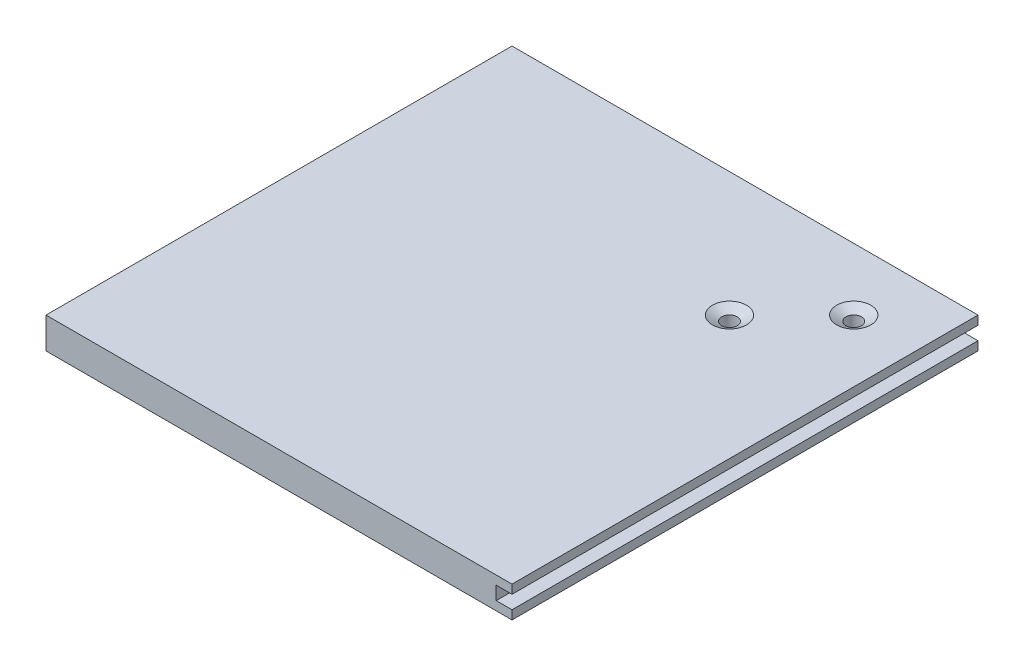
ISO-10303-21;
HEADER;
FILE_DESCRIPTION(('STEP AP214'),'2;1');
FILE_NAME('part.step','',(''),(''),'','','');
FILE_SCHEMA(('AUTOMOTIVE_DESIGN { 1 0 10303 214 1 1 1 1 }'));
ENDSEC;
DATA;
#1=APPLICATION_CONTEXT('core data for automotive mechanical design processes');
#2=APPLICATION_PROTOCOL_DEFINITION('international standard','automotive_design',2000,#1);
#3=PRODUCT_CONTEXT('',#1,'mechanical');
#4=PRODUCT('Part','Part','',(#3));
#5=PRODUCT_RELATED_PRODUCT_CATEGORY('part','',(#4));
#6=PRODUCT_DEFINITION_FORMATION('','',#4);
#7=PRODUCT_DEFINITION_CONTEXT('part definition',#1,'design');
#8=PRODUCT_DEFINITION('design','',#6,#7);
#9=PRODUCT_DEFINITION_SHAPE('','',#8);
#10=(LENGTH_UNIT() NAMED_UNIT(*) SI_UNIT(.MILLI.,.METRE.));
#11=(NAMED_UNIT(*) PLANE_ANGLE_UNIT() SI_UNIT($,.RADIAN.));
#12=(NAMED_UNIT(*) SI_UNIT($,.STERADIAN.) SOLID_ANGLE_UNIT());
#13=UNCERTAINTY_MEASURE_WITH_UNIT(LENGTH_MEASURE(1.E-05),#10,'distance_accuracy_value','');
#14=(GEOMETRIC_REPRESENTATION_CONTEXT(3) GLOBAL_UNCERTAINTY_ASSIGNED_CONTEXT((#13)) GLOBAL_UNIT_ASSIGNED_CONTEXT((#10,
#11,#12)) REPRESENTATION_CONTEXT('',''));
#15=CARTESIAN_POINT('',(0.,0.,0.));
#16=DIRECTION('',(0.,0.,1.));
#17=DIRECTION('',(1.,0.,0.));
#18=AXIS2_PLACEMENT_3D('',#15,#16,#17);
#19=CARTESIAN_POINT('',(150.,10.,-150.));
#20=DIRECTION('',(0.,0.,1.));
#21=DIRECTION('',(1.,0.,0.));
#22=AXIS2_PLACEMENT_3D('',#19,#20,#21);
#23=PLANE('',#22);
#24=DIRECTION('',(-1.,0.,0.));
#25=VECTOR('',#24,1.);
#26=CARTESIAN_POINT('',(150.,7.14999999999999,-150.));
#27=LINE('',#26,#25);
#28=CARTESIAN_POINT('',(150.,7.14999999999999,-150.));
#29=VERTEX_POINT('',#28);
#30=CARTESIAN_POINT('',(0.,7.14999999999999,-150.));
#31=VERTEX_POINT('',#30);
#32=EDGE_CURVE('E160',#29,#31,#27,.T.);
#33=ORIENTED_EDGE('',*,*,#32,.T.);
#34=DIRECTION('',(0.,-1.,0.));
#35=VECTOR('',#34,1.);
#36=CARTESIAN_POINT('',(0.,10.,-150.));
#37=LINE('',#36,#35);
#38=CARTESIAN_POINT('',(0.,10.,-150.));
#39=VERTEX_POINT('',#38);
#40=EDGE_CURVE('E148',#39,#31,#37,.T.);
#41=ORIENTED_EDGE('',*,*,#40,.F.);
#42=DIRECTION('',(-1.,0.,0.));
#43=VECTOR('',#42,1.);
#44=CARTESIAN_POINT('',(150.,10.,-150.));
#45=LINE('',#44,#43);
#46=CARTESIAN_POINT('',(150.,10.,-150.));
#47=VERTEX_POINT('',#46);
#48=EDGE_CURVE('E185',#47,#39,#45,.T.);
#49=ORIENTED_EDGE('',*,*,#48,.F.);
#50=DIRECTION('',(0.,-1.,0.));
#51=VECTOR('',#50,1.);
#52=CARTESIAN_POINT('',(150.,10.,-150.));
#53=LINE('',#52,#51);
#54=EDGE_CURVE('E202',#47,#29,#53,.T.);
#55=ORIENTED_EDGE('',*,*,#54,.T.);
#56=EDGE_LOOP('',(#33,#41,#49,#55));
#57=FACE_BOUND('',#56,.T.);
#58=ADVANCED_FACE('F43',(#57),#23,.F.);
#59=CARTESIAN_POINT('',(150.,10.,0.));
#60=DIRECTION('',(-1.,0.,0.));
#61=DIRECTION('',(0.,0.,1.));
#62=AXIS2_PLACEMENT_3D('',#59,#60,#61);
#63=PLANE('',#62);
#64=CARTESIAN_POINT('',(150.,2.84999999999999,-150.));
#65=VERTEX_POINT('',#64);
#66=CARTESIAN_POINT('',(150.,0.,-150.));
#67=VERTEX_POINT('',#66);
#68=EDGE_CURVE('E201',#65,#67,#53,.T.);
#69=ORIENTED_EDGE('',*,*,#68,.F.);
#70=DIRECTION('',(0.,0.,1.));
#71=VECTOR('',#70,1.);
#72=CARTESIAN_POINT('',(150.,2.84999999999999,-150.));
#73=LINE('',#72,#71);
#74=CARTESIAN_POINT('',(150.,2.84999999999999,0.));
#75=VERTEX_POINT('',#74);
#76=EDGE_CURVE('E166',#65,#75,#73,.T.);
#77=ORIENTED_EDGE('',*,*,#76,.T.);
#78=DIRECTION('',(0.,-1.,0.));
#79=VECTOR('',#78,1.);
#80=CARTESIAN_POINT('',(150.,10.,0.));
#81=LINE('',#80,#79);
#82=CARTESIAN_POINT('',(150.,0.,0.));
#83=VERTEX_POINT('',#82);
#84=EDGE_CURVE('E205',#75,#83,#81,.T.);
#85=ORIENTED_EDGE('',*,*,#84,.T.);
#86=DIRECTION('',(0.,0.,-1.));
#87=VECTOR('',#86,1.);
#88=CARTESIAN_POINT('',(150.,0.,0.));
#89=LINE('',#88,#87);
#90=EDGE_CURVE('E191',#83,#67,#89,.T.);
#91=ORIENTED_EDGE('',*,*,#90,.T.);
#92=EDGE_LOOP('',(#69,#77,#85,#91));
#93=FACE_BOUND('',#92,.T.);
#94=ADVANCED_FACE('F262',(#93),#63,.F.);
#95=CARTESIAN_POINT('',(0.,10.,0.));
#96=DIRECTION('',(0.,0.,-1.));
#97=DIRECTION('',(-1.,0.,0.));
#98=AXIS2_PLACEMENT_3D('',#95,#96,#97);
#99=PLANE('',#98);
#100=ORIENTED_EDGE('',*,*,#84,.F.);
#101=DIRECTION('',(-1.,0.,0.));
#102=VECTOR('',#101,1.);
#103=CARTESIAN_POINT('',(0.,2.84999999999999,0.));
#104=LINE('',#103,#102);
#105=CARTESIAN_POINT('',(144.9,2.84999999999999,0.));
#106=VERTEX_POINT('',#105);
#107=EDGE_CURVE('E178',#75,#106,#104,.T.);
#108=ORIENTED_EDGE('',*,*,#107,.T.);
#109=DIRECTION('',(0.,1.,0.));
#110=VECTOR('',#109,1.);
#111=CARTESIAN_POINT('',(144.9,10.,0.));
#112=LINE('',#111,#110);
#113=CARTESIAN_POINT('',(144.9,7.14999999999999,0.));
#114=VERTEX_POINT('',#113);
#115=EDGE_CURVE('E175',#106,#114,#112,.T.);
#116=ORIENTED_EDGE('',*,*,#115,.T.);
#117=DIRECTION('',(1.,0.,0.));
#118=VECTOR('',#117,1.);
#119=CARTESIAN_POINT('',(0.,7.14999999999997,0.));
#120=LINE('',#119,#118);
#121=CARTESIAN_POINT('',(150.,7.14999999999999,0.));
#122=VERTEX_POINT('',#121);
#123=EDGE_CURVE('E168',#114,#122,#120,.T.);
#124=ORIENTED_EDGE('',*,*,#123,.T.);
#125=CARTESIAN_POINT('',(150.,10.,0.));
#126=VERTEX_POINT('',#125);
#127=EDGE_CURVE('E206',#126,#122,#81,.T.);
#128=ORIENTED_EDGE('',*,*,#127,.F.);
#129=DIRECTION('',(1.,0.,0.));
#130=VECTOR('',#129,1.);
#131=CARTESIAN_POINT('',(0.,10.,0.));
#132=LINE('',#131,#130);
#133=CARTESIAN_POINT('',(0.,10.,0.));
#134=VERTEX_POINT('',#133);
#135=EDGE_CURVE('E182',#134,#126,#132,.T.);
#136=ORIENTED_EDGE('',*,*,#135,.F.);
#137=DIRECTION('',(0.,-1.,0.));
#138=VECTOR('',#137,1.);
#139=CARTESIAN_POINT('',(0.,10.,0.));
#140=LINE('',#139,#138);
#141=CARTESIAN_POINT('',(0.,0.,0.));
#142=VERTEX_POINT('',#141);
#143=EDGE_CURVE('E188',#134,#142,#140,.T.);
#144=ORIENTED_EDGE('',*,*,#143,.T.);
#145=DIRECTION('',(1.,0.,0.));
#146=VECTOR('',#145,1.);
#147=CARTESIAN_POINT('',(0.,0.,0.));
#148=LINE('',#147,#146);
#149=EDGE_CURVE('E181',#142,#83,#148,.T.);
#150=ORIENTED_EDGE('',*,*,#149,.T.);
#151=EDGE_LOOP('',(#100,#108,#116,#124,#128,#136,#144,#150));
#152=FACE_BOUND('',#151,.T.);
#153=ADVANCED_FACE('F244',(#152),#99,.F.);
#154=ORIENTED_EDGE('',*,*,#127,.T.);
#155=DIRECTION('',(0.,0.,1.));
#156=VECTOR('',#155,1.);
#157=CARTESIAN_POINT('',(150.,7.14999999999999,-150.));
#158=LINE('',#157,#156);
#159=EDGE_CURVE('E165',#29,#122,#158,.T.);
#160=ORIENTED_EDGE('',*,*,#159,.F.);
#161=ORIENTED_EDGE('',*,*,#54,.F.);
#162=DIRECTION('',(0.,0.,-1.));
#163=VECTOR('',#162,1.);
#164=CARTESIAN_POINT('',(150.,10.,0.));
#165=LINE('',#164,#163);
#166=EDGE_CURVE('E96',#126,#47,#165,.T.);
#167=ORIENTED_EDGE('',*,*,#166,.F.);
#168=EDGE_LOOP('',(#154,#160,#161,#167));
#169=FACE_BOUND('',#168,.T.);
#170=ADVANCED_FACE('F249',(#169),#63,.F.);
#171=CARTESIAN_POINT('',(0.,2.84999999999999,-150.));
#172=VERTEX_POINT('',#171);
#173=CARTESIAN_POINT('',(0.,0.,-150.));
#174=VERTEX_POINT('',#173);
#175=EDGE_CURVE('E199',#172,#174,#37,.T.);
#176=ORIENTED_EDGE('',*,*,#175,.F.);
#177=DIRECTION('',(1.,0.,0.));
#178=VECTOR('',#177,1.);
#179=CARTESIAN_POINT('',(144.9,2.84999999999999,-150.));
#180=LINE('',#179,#178);
#181=EDGE_CURVE('E162',#172,#65,#180,.T.);
#182=ORIENTED_EDGE('',*,*,#181,.T.);
#183=ORIENTED_EDGE('',*,*,#68,.T.);
#184=DIRECTION('',(-1.,0.,0.));
#185=VECTOR('',#184,1.);
#186=CARTESIAN_POINT('',(150.,0.,-150.));
#187=LINE('',#186,#185);
#188=EDGE_CURVE('E194',#67,#174,#187,.T.);
#189=ORIENTED_EDGE('',*,*,#188,.T.);
#190=EDGE_LOOP('',(#176,#182,#183,#189));
#191=FACE_BOUND('',#190,.T.);
#192=ADVANCED_FACE('F259',(#191),#23,.F.);
#193=CARTESIAN_POINT('',(0.,10.,0.));
#194=DIRECTION('',(1.,0.,0.));
#195=DIRECTION('',(0.,0.,-1.));
#196=AXIS2_PLACEMENT_3D('',#193,#194,#195);
#197=PLANE('',#196);
#198=ORIENTED_EDGE('',*,*,#40,.T.);
#199=DIRECTION('',(0.,0.,1.));
#200=VECTOR('',#199,1.);
#201=CARTESIAN_POINT('',(0.,7.14999999999999,-150.));
#202=LINE('',#201,#200);
#203=CARTESIAN_POINT('',(0.,7.14999999999999,-145.));
#204=VERTEX_POINT('',#203);
#205=EDGE_CURVE('E132',#31,#204,#202,.T.);
#206=ORIENTED_EDGE('',*,*,#205,.T.);
#207=DIRECTION('',(0.,-1.,0.));
#208=VECTOR('',#207,1.);
#209=CARTESIAN_POINT('',(0.,7.14999999999999,-145.));
#210=LINE('',#209,#208);
#211=CARTESIAN_POINT('',(0.,2.84999999999999,-145.));
#212=VERTEX_POINT('',#211);
#213=EDGE_CURVE('E140',#204,#212,#210,.T.);
#214=ORIENTED_EDGE('',*,*,#213,.T.);
#215=DIRECTION('',(0.,0.,-1.));
#216=VECTOR('',#215,1.);
#217=CARTESIAN_POINT('',(0.,2.84999999999999,-145.));
#218=LINE('',#217,#216);
#219=EDGE_CURVE('E137',#212,#172,#218,.T.);
#220=ORIENTED_EDGE('',*,*,#219,.T.);
#221=ORIENTED_EDGE('',*,*,#175,.T.);
#222=DIRECTION('',(0.,0.,1.));
#223=VECTOR('',#222,1.);
#224=CARTESIAN_POINT('',(0.,0.,0.));
#225=LINE('',#224,#223);
#226=EDGE_CURVE('E88',#174,#142,#225,.T.);
#227=ORIENTED_EDGE('',*,*,#226,.T.);
#228=ORIENTED_EDGE('',*,*,#143,.F.);
#229=DIRECTION('',(0.,0.,1.));
#230=VECTOR('',#229,1.);
#231=CARTESIAN_POINT('',(0.,10.,0.));
#232=LINE('',#231,#230);
#233=EDGE_CURVE('E68',#39,#134,#232,.T.);
#234=ORIENTED_EDGE('',*,*,#233,.F.);
#235=EDGE_LOOP('',(#198,#206,#214,#220,#221,#227,#228,#234));
#236=FACE_BOUND('',#235,.T.);
#237=ADVANCED_FACE('F146',(#236),#197,.F.);
#238=CARTESIAN_POINT('',(0.,10.,0.));
#239=DIRECTION('',(0.,1.,0.));
#240=DIRECTION('',(0.,0.,1.));
#241=AXIS2_PLACEMENT_3D('',#238,#239,#240);
#242=PLANE('',#241);
#243=CARTESIAN_POINT('',(130.,10.,-130.));
#244=DIRECTION('',(0.,1.,0.));
#245=DIRECTION('',(0.,0.,1.));
#246=AXIS2_PLACEMENT_3D('',#243,#244,#245);
#247=CIRCLE('',#246,5.50000000000001);
#248=CARTESIAN_POINT('',(130.,10.,-124.5));
#249=VERTEX_POINT('',#248);
#250=EDGE_CURVE('E52',#249,#249,#247,.F.);
#251=ORIENTED_EDGE('',*,*,#250,.T.);
#252=EDGE_LOOP('',(#251));
#253=FACE_BOUND('',#252,.T.);
#254=CARTESIAN_POINT('',(110.,10.,-110.));
#255=DIRECTION('',(0.,1.,0.));
#256=DIRECTION('',(0.,0.,1.));
#257=AXIS2_PLACEMENT_3D('',#254,#255,#256);
#258=CIRCLE('',#257,5.50000000000001);
#259=CARTESIAN_POINT('',(110.,10.,-104.5));
#260=VERTEX_POINT('',#259);
#261=EDGE_CURVE('E211',#260,#260,#258,.F.);
#262=ORIENTED_EDGE('',*,*,#261,.T.);
#263=EDGE_LOOP('',(#262));
#264=FACE_BOUND('',#263,.T.);
#265=ORIENTED_EDGE('',*,*,#135,.T.);
#266=ORIENTED_EDGE('',*,*,#166,.T.);
#267=ORIENTED_EDGE('',*,*,#48,.T.);
#268=ORIENTED_EDGE('',*,*,#233,.T.);
#269=EDGE_LOOP('',(#265,#266,#267,#268));
#270=FACE_BOUND('',#269,.T.);
#271=ADVANCED_FACE('F216',(#253,#264,#270),#242,.T.);
#272=CARTESIAN_POINT('',(0.,0.,0.));
#273=DIRECTION('',(0.,1.,0.));
#274=DIRECTION('',(0.,0.,1.));
#275=AXIS2_PLACEMENT_3D('',#272,#273,#274);
#276=PLANE('',#275);
#277=CARTESIAN_POINT('',(130.,0.,-130.));
#278=DIRECTION('',(0.,1.,0.));
#279=DIRECTION('',(0.,0.,1.));
#280=AXIS2_PLACEMENT_3D('',#277,#278,#279);
#281=CIRCLE('',#280,2.5);
#282=CARTESIAN_POINT('',(130.,0.,-127.5));
#283=VERTEX_POINT('',#282);
#284=EDGE_CURVE('E149',#283,#283,#281,.T.);
#285=ORIENTED_EDGE('',*,*,#284,.T.);
#286=EDGE_LOOP('',(#285));
#287=FACE_BOUND('',#286,.T.);
#288=CARTESIAN_POINT('',(110.,0.,-110.));
#289=DIRECTION('',(0.,1.,0.));
#290=DIRECTION('',(0.,0.,1.));
#291=AXIS2_PLACEMENT_3D('',#288,#289,#290);
#292=CIRCLE('',#291,2.5);
#293=CARTESIAN_POINT('',(110.,0.,-107.5));
#294=VERTEX_POINT('',#293);
#295=EDGE_CURVE('E152',#294,#294,#292,.T.);
#296=ORIENTED_EDGE('',*,*,#295,.T.);
#297=EDGE_LOOP('',(#296));
#298=FACE_BOUND('',#297,.T.);
#299=ORIENTED_EDGE('',*,*,#149,.F.);
#300=ORIENTED_EDGE('',*,*,#226,.F.);
#301=ORIENTED_EDGE('',*,*,#188,.F.);
#302=ORIENTED_EDGE('',*,*,#90,.F.);
#303=EDGE_LOOP('',(#299,#300,#301,#302));
#304=FACE_BOUND('',#303,.T.);
#305=ADVANCED_FACE('F231',(#287,#298,#304),#276,.F.);
#306=CARTESIAN_POINT('',(144.9,2.84999999999999,-150.));
#307=DIRECTION('',(0.,-1.,0.));
#308=DIRECTION('',(0.,0.,-1.));
#309=AXIS2_PLACEMENT_3D('',#306,#307,#308);
#310=PLANE('',#309);
#311=ORIENTED_EDGE('',*,*,#107,.F.);
#312=ORIENTED_EDGE('',*,*,#76,.F.);
#313=ORIENTED_EDGE('',*,*,#181,.F.);
#314=ORIENTED_EDGE('',*,*,#219,.F.);
#315=DIRECTION('',(1.,0.,0.));
#316=VECTOR('',#315,1.);
#317=CARTESIAN_POINT('',(0.,2.84999999999999,-145.));
#318=LINE('',#317,#316);
#319=CARTESIAN_POINT('',(144.9,2.84999999999999,-145.));
#320=VERTEX_POINT('',#319);
#321=EDGE_CURVE('E136',#212,#320,#318,.T.);
#322=ORIENTED_EDGE('',*,*,#321,.T.);
#323=DIRECTION('',(0.,0.,1.));
#324=VECTOR('',#323,1.);
#325=CARTESIAN_POINT('',(144.9,2.84999999999999,-150.));
#326=LINE('',#325,#324);
#327=EDGE_CURVE('E169',#320,#106,#326,.T.);
#328=ORIENTED_EDGE('',*,*,#327,.T.);
#329=EDGE_LOOP('',(#311,#312,#313,#314,#322,#328));
#330=FACE_BOUND('',#329,.T.);
#331=ADVANCED_FACE('F234',(#330),#310,.F.);
#332=CARTESIAN_POINT('',(144.9,7.14999999999999,-150.));
#333=DIRECTION('',(-1.,0.,0.));
#334=DIRECTION('',(0.,0.,1.));
#335=AXIS2_PLACEMENT_3D('',#332,#333,#334);
#336=PLANE('',#335);
#337=ORIENTED_EDGE('',*,*,#327,.F.);
#338=DIRECTION('',(0.,1.,0.));
#339=VECTOR('',#338,1.);
#340=CARTESIAN_POINT('',(144.9,7.14999999999999,-145.));
#341=LINE('',#340,#339);
#342=CARTESIAN_POINT('',(144.9,7.14999999999999,-145.));
#343=VERTEX_POINT('',#342);
#344=EDGE_CURVE('E157',#320,#343,#341,.T.);
#345=ORIENTED_EDGE('',*,*,#344,.T.);
#346=DIRECTION('',(0.,0.,1.));
#347=VECTOR('',#346,1.);
#348=CARTESIAN_POINT('',(144.9,7.14999999999999,-150.));
#349=LINE('',#348,#347);
#350=EDGE_CURVE('E135',#343,#114,#349,.T.);
#351=ORIENTED_EDGE('',*,*,#350,.T.);
#352=ORIENTED_EDGE('',*,*,#115,.F.);
#353=EDGE_LOOP('',(#337,#345,#351,#352));
#354=FACE_BOUND('',#353,.T.);
#355=ADVANCED_FACE('F255',(#354),#336,.F.);
#356=CARTESIAN_POINT('',(150.,7.14999999999999,-150.));
#357=DIRECTION('',(0.,1.,0.));
#358=DIRECTION('',(-1.,0.,0.));
#359=AXIS2_PLACEMENT_3D('',#356,#357,#358);
#360=PLANE('',#359);
#361=ORIENTED_EDGE('',*,*,#350,.F.);
#362=DIRECTION('',(1.,0.,0.));
#363=VECTOR('',#362,1.);
#364=CARTESIAN_POINT('',(0.,7.14999999999999,-145.));
#365=LINE('',#364,#363);
#366=EDGE_CURVE('E59',#204,#343,#365,.T.);
#367=ORIENTED_EDGE('',*,*,#366,.F.);
#368=ORIENTED_EDGE('',*,*,#205,.F.);
#369=ORIENTED_EDGE('',*,*,#32,.F.);
#370=ORIENTED_EDGE('',*,*,#159,.T.);
#371=ORIENTED_EDGE('',*,*,#123,.F.);
#372=EDGE_LOOP('',(#361,#367,#368,#369,#370,#371));
#373=FACE_BOUND('',#372,.T.);
#374=ADVANCED_FACE('F130',(#373),#360,.F.);
#375=CARTESIAN_POINT('',(0.,7.14999999999999,-145.));
#376=DIRECTION('',(0.,0.,1.));
#377=DIRECTION('',(1.,0.,0.));
#378=AXIS2_PLACEMENT_3D('',#375,#376,#377);
#379=PLANE('',#378);
#380=ORIENTED_EDGE('',*,*,#321,.F.);
#381=ORIENTED_EDGE('',*,*,#213,.F.);
#382=ORIENTED_EDGE('',*,*,#366,.T.);
#383=ORIENTED_EDGE('',*,*,#344,.F.);
#384=EDGE_LOOP('',(#380,#381,#382,#383));
#385=FACE_BOUND('',#384,.T.);
#386=ADVANCED_FACE('F141',(#385),#379,.F.);
#387=CARTESIAN_POINT('',(110.,0.,-110.));
#388=DIRECTION('',(0.,1.,0.));
#389=DIRECTION('',(0.,0.,1.));
#390=AXIS2_PLACEMENT_3D('',#387,#388,#389);
#391=CYLINDRICAL_SURFACE('',#390,2.5);
#392=CARTESIAN_POINT('',(110.,8.26794919243111,-110.));
#393=DIRECTION('',(0.,1.,0.));
#394=DIRECTION('',(0.,0.,1.));
#395=AXIS2_PLACEMENT_3D('',#392,#393,#394);
#396=CIRCLE('',#395,2.5);
#397=CARTESIAN_POINT('',(110.,8.26794919243111,-107.5));
#398=VERTEX_POINT('',#397);
#399=EDGE_CURVE('E11',#398,#398,#396,.T.);
#400=ORIENTED_EDGE('',*,*,#399,.T.);
#401=EDGE_LOOP('',(#400));
#402=FACE_BOUND('',#401,.T.);
#403=ORIENTED_EDGE('',*,*,#295,.F.);
#404=EDGE_LOOP('',(#403));
#405=FACE_BOUND('',#404,.T.);
#406=ADVANCED_FACE('F227',(#402,#405),#391,.F.);
#407=CARTESIAN_POINT('',(130.,0.,-130.));
#408=DIRECTION('',(0.,1.,0.));
#409=DIRECTION('',(0.,0.,1.));
#410=AXIS2_PLACEMENT_3D('',#407,#408,#409);
#411=CYLINDRICAL_SURFACE('',#410,2.5);
#412=CARTESIAN_POINT('',(130.,8.26794919243111,-130.));
#413=DIRECTION('',(0.,1.,0.));
#414=DIRECTION('',(0.,0.,1.));
#415=AXIS2_PLACEMENT_3D('',#412,#413,#414);
#416=CIRCLE('',#415,2.5);
#417=CARTESIAN_POINT('',(130.,8.26794919243111,-127.5));
#418=VERTEX_POINT('',#417);
#419=EDGE_CURVE('E208',#418,#418,#416,.T.);
#420=ORIENTED_EDGE('',*,*,#419,.T.);
#421=EDGE_LOOP('',(#420));
#422=FACE_BOUND('',#421,.T.);
#423=ORIENTED_EDGE('',*,*,#284,.F.);
#424=EDGE_LOOP('',(#423));
#425=FACE_BOUND('',#424,.T.);
#426=ADVANCED_FACE('F222',(#422,#425),#411,.F.);
#427=CARTESIAN_POINT('',(130.,8.26794919243111,-130.));
#428=DIRECTION('',(0.,1.,0.));
#429=DIRECTION('',(0.,0.,1.));
#430=AXIS2_PLACEMENT_3D('',#427,#428,#429);
#431=CONICAL_SURFACE('',#430,2.5,1.04719755119659);
#432=ORIENTED_EDGE('',*,*,#250,.F.);
#433=EDGE_LOOP('',(#432));
#434=FACE_BOUND('',#433,.T.);
#435=ORIENTED_EDGE('',*,*,#419,.F.);
#436=EDGE_LOOP('',(#435));
#437=FACE_BOUND('',#436,.T.);
#438=ADVANCED_FACE('F219',(#434,#437),#431,.F.);
#439=CARTESIAN_POINT('',(110.,8.26794919243111,-110.));
#440=DIRECTION('',(0.,1.,0.));
#441=DIRECTION('',(0.,0.,1.));
#442=AXIS2_PLACEMENT_3D('',#439,#440,#441);
#443=CONICAL_SURFACE('',#442,2.5,1.04719755119659);
#444=ORIENTED_EDGE('',*,*,#261,.F.);
#445=EDGE_LOOP('',(#444));
#446=FACE_BOUND('',#445,.T.);
#447=ORIENTED_EDGE('',*,*,#399,.F.);
#448=EDGE_LOOP('',(#447));
#449=FACE_BOUND('',#448,.T.);
#450=ADVANCED_FACE('F46',(#446,#449),#443,.F.);
#451=CLOSED_SHELL('',(#58,#94,#153,#170,#192,#237,#271,#305,#331,#355,#374,#386,#406,#426,#438,#450));
#452=MANIFOLD_SOLID_BREP('B2',#451);
#453=ADVANCED_BREP_SHAPE_REPRESENTATION('',(#18,#452),#14);
#454=SHAPE_DEFINITION_REPRESENTATION(#9,#453);
ENDSEC;
END-ISO-10303-21;
